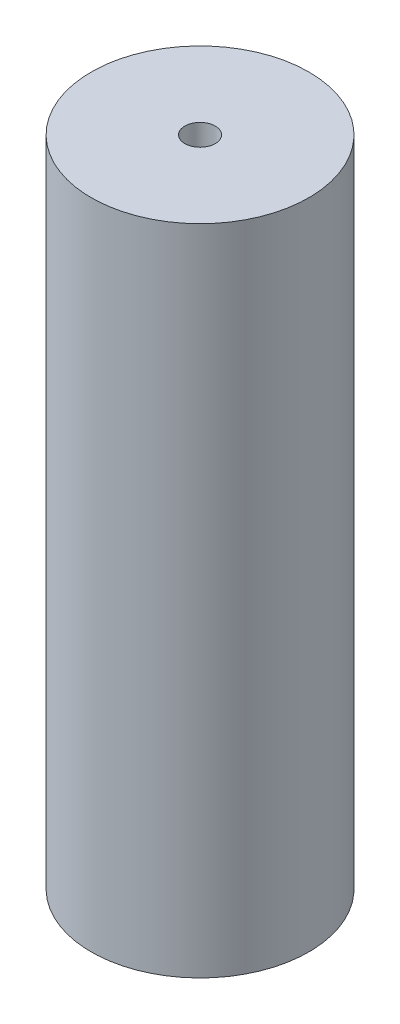
ISO-10303-21;
HEADER;
FILE_DESCRIPTION(('STEP AP214'),'2;1');
FILE_NAME('part.step','',(''),(''),'','','');
FILE_SCHEMA(('AUTOMOTIVE_DESIGN { 1 0 10303 214 1 1 1 1 }'));
ENDSEC;
DATA;
#1=APPLICATION_CONTEXT('core data for automotive mechanical design processes');
#2=APPLICATION_PROTOCOL_DEFINITION('international standard','automotive_design',2000,#1);
#3=PRODUCT_CONTEXT('',#1,'mechanical');
#4=PRODUCT('Part','Part','',(#3));
#5=PRODUCT_RELATED_PRODUCT_CATEGORY('part','',(#4));
#6=PRODUCT_DEFINITION_FORMATION('','',#4);
#7=PRODUCT_DEFINITION_CONTEXT('part definition',#1,'design');
#8=PRODUCT_DEFINITION('design','',#6,#7);
#9=PRODUCT_DEFINITION_SHAPE('','',#8);
#10=(LENGTH_UNIT() NAMED_UNIT(*) SI_UNIT(.MILLI.,.METRE.));
#11=(NAMED_UNIT(*) PLANE_ANGLE_UNIT() SI_UNIT($,.RADIAN.));
#12=(NAMED_UNIT(*) SI_UNIT($,.STERADIAN.) SOLID_ANGLE_UNIT());
#13=UNCERTAINTY_MEASURE_WITH_UNIT(LENGTH_MEASURE(1.E-05),#10,'distance_accuracy_value','');
#14=(GEOMETRIC_REPRESENTATION_CONTEXT(3) GLOBAL_UNCERTAINTY_ASSIGNED_CONTEXT((#13)) GLOBAL_UNIT_ASSIGNED_CONTEXT((#10,
#11,#12)) REPRESENTATION_CONTEXT('',''));
#15=CARTESIAN_POINT('',(0.,0.,0.));
#16=DIRECTION('',(0.,0.,1.));
#17=DIRECTION('',(1.,0.,0.));
#18=AXIS2_PLACEMENT_3D('',#15,#16,#17);
#19=CARTESIAN_POINT('',(-2.5,15.,0.));
#20=DIRECTION('',(0.,-1.,0.));
#21=DIRECTION('',(0.,0.,-1.));
#22=AXIS2_PLACEMENT_3D('',#19,#20,#21);
#23=PLANE('',#22);
#24=CARTESIAN_POINT('',(0.,15.,0.));
#25=DIRECTION('',(0.,-1.,0.));
#26=DIRECTION('',(0.,0.,-1.));
#27=AXIS2_PLACEMENT_3D('',#24,#25,#26);
#28=CIRCLE('',#27,2.5);
#29=CARTESIAN_POINT('',(0.,15.,-2.5));
#30=VERTEX_POINT('',#29);
#31=EDGE_CURVE('E59',#30,#30,#28,.T.);
#32=ORIENTED_EDGE('',*,*,#31,.F.);
#33=EDGE_LOOP('',(#32));
#34=FACE_BOUND('',#33,.T.);
#35=CARTESIAN_POINT('',(0.,15.,0.));
#36=DIRECTION('',(0.,-1.,0.));
#37=DIRECTION('',(0.,0.,-1.));
#38=AXIS2_PLACEMENT_3D('',#35,#36,#37);
#39=CIRCLE('',#38,0.35);
#40=CARTESIAN_POINT('',(0.,15.,-0.35));
#41=VERTEX_POINT('',#40);
#42=EDGE_CURVE('E10',#41,#41,#39,.T.);
#43=ORIENTED_EDGE('',*,*,#42,.T.);
#44=EDGE_LOOP('',(#43));
#45=FACE_BOUND('',#44,.T.);
#46=ADVANCED_FACE('F37',(#34,#45),#23,.F.);
#47=CARTESIAN_POINT('',(0.,0.,0.));
#48=DIRECTION('',(0.,-1.,0.));
#49=DIRECTION('',(0.,0.,-1.));
#50=AXIS2_PLACEMENT_3D('',#47,#48,#49);
#51=CYLINDRICAL_SURFACE('',#50,0.349999999999999);
#52=ORIENTED_EDGE('',*,*,#42,.F.);
#53=EDGE_LOOP('',(#52));
#54=FACE_BOUND('',#53,.T.);
#55=CARTESIAN_POINT('',(0.,5.,0.));
#56=DIRECTION('',(0.,-1.,0.));
#57=DIRECTION('',(0.,0.,-1.));
#58=AXIS2_PLACEMENT_3D('',#55,#56,#57);
#59=CIRCLE('',#58,0.349999999999999);
#60=CARTESIAN_POINT('',(0.,5.,-0.349999999999999));
#61=VERTEX_POINT('',#60);
#62=EDGE_CURVE('E43',#61,#61,#59,.T.);
#63=ORIENTED_EDGE('',*,*,#62,.T.);
#64=EDGE_LOOP('',(#63));
#65=FACE_BOUND('',#64,.T.);
#66=ADVANCED_FACE('F66',(#54,#65),#51,.F.);
#67=CARTESIAN_POINT('',(-0.349999999999999,5.,0.));
#68=DIRECTION('',(0.,1.,0.));
#69=DIRECTION('',(0.,0.,1.));
#70=AXIS2_PLACEMENT_3D('',#67,#68,#69);
#71=PLANE('',#70);
#72=ORIENTED_EDGE('',*,*,#62,.F.);
#73=EDGE_LOOP('',(#72));
#74=FACE_BOUND('',#73,.T.);
#75=CARTESIAN_POINT('',(0.,5.,0.));
#76=DIRECTION('',(0.,-1.,0.));
#77=DIRECTION('',(0.,0.,-1.));
#78=AXIS2_PLACEMENT_3D('',#75,#76,#77);
#79=CIRCLE('',#78,1.25);
#80=CARTESIAN_POINT('',(0.,5.,-1.25));
#81=VERTEX_POINT('',#80);
#82=EDGE_CURVE('E47',#81,#81,#79,.T.);
#83=ORIENTED_EDGE('',*,*,#82,.T.);
#84=EDGE_LOOP('',(#83));
#85=FACE_BOUND('',#84,.T.);
#86=ADVANCED_FACE('F70',(#74,#85),#71,.F.);
#87=CARTESIAN_POINT('',(0.,0.,0.));
#88=DIRECTION('',(0.,-1.,0.));
#89=DIRECTION('',(0.,0.,-1.));
#90=AXIS2_PLACEMENT_3D('',#87,#88,#89);
#91=CYLINDRICAL_SURFACE('',#90,1.25);
#92=ORIENTED_EDGE('',*,*,#82,.F.);
#93=EDGE_LOOP('',(#92));
#94=FACE_BOUND('',#93,.T.);
#95=CARTESIAN_POINT('',(0.,0.,0.));
#96=DIRECTION('',(0.,-1.,0.));
#97=DIRECTION('',(0.,0.,-1.));
#98=AXIS2_PLACEMENT_3D('',#95,#96,#97);
#99=CIRCLE('',#98,1.25);
#100=CARTESIAN_POINT('',(0.,0.,-1.25));
#101=VERTEX_POINT('',#100);
#102=EDGE_CURVE('E51',#101,#101,#99,.T.);
#103=ORIENTED_EDGE('',*,*,#102,.T.);
#104=EDGE_LOOP('',(#103));
#105=FACE_BOUND('',#104,.T.);
#106=ADVANCED_FACE('F75',(#94,#105),#91,.F.);
#107=CARTESIAN_POINT('',(-1.25,0.,0.));
#108=DIRECTION('',(0.,1.,0.));
#109=DIRECTION('',(0.,0.,1.));
#110=AXIS2_PLACEMENT_3D('',#107,#108,#109);
#111=PLANE('',#110);
#112=ORIENTED_EDGE('',*,*,#102,.F.);
#113=EDGE_LOOP('',(#112));
#114=FACE_BOUND('',#113,.T.);
#115=CARTESIAN_POINT('',(0.,0.,0.));
#116=DIRECTION('',(0.,-1.,0.));
#117=DIRECTION('',(0.,0.,-1.));
#118=AXIS2_PLACEMENT_3D('',#115,#116,#117);
#119=CIRCLE('',#118,2.5);
#120=CARTESIAN_POINT('',(0.,0.,-2.5));
#121=VERTEX_POINT('',#120);
#122=EDGE_CURVE('E56',#121,#121,#119,.T.);
#123=ORIENTED_EDGE('',*,*,#122,.T.);
#124=EDGE_LOOP('',(#123));
#125=FACE_BOUND('',#124,.T.);
#126=ADVANCED_FACE('F81',(#114,#125),#111,.F.);
#127=CARTESIAN_POINT('',(0.,0.,0.));
#128=DIRECTION('',(0.,-1.,0.));
#129=DIRECTION('',(0.,0.,-1.));
#130=AXIS2_PLACEMENT_3D('',#127,#128,#129);
#131=CYLINDRICAL_SURFACE('',#130,2.5);
#132=ORIENTED_EDGE('',*,*,#122,.F.);
#133=EDGE_LOOP('',(#132));
#134=FACE_BOUND('',#133,.T.);
#135=ORIENTED_EDGE('',*,*,#31,.T.);
#136=EDGE_LOOP('',(#135));
#137=FACE_BOUND('',#136,.T.);
#138=ADVANCED_FACE('F63',(#134,#137),#131,.T.);
#139=CLOSED_SHELL('',(#46,#66,#86,#106,#126,#138));
#140=MANIFOLD_SOLID_BREP('B2',#139);
#141=ADVANCED_BREP_SHAPE_REPRESENTATION('',(#18,#140),#14);
#142=SHAPE_DEFINITION_REPRESENTATION(#9,#141);
ENDSEC;
END-ISO-10303-21;
